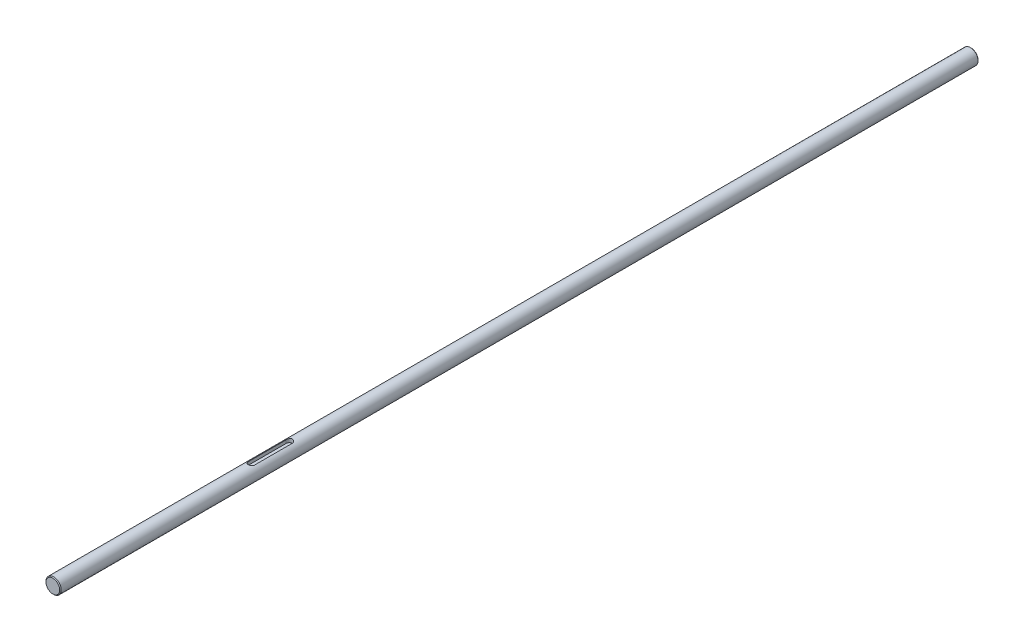
ISO-10303-21;
HEADER;
FILE_DESCRIPTION(('STEP AP214'),'2;1');
FILE_NAME('part.step','',(''),(''),'','','');
FILE_SCHEMA(('AUTOMOTIVE_DESIGN { 1 0 10303 214 1 1 1 1 }'));
ENDSEC;
DATA;
#1=APPLICATION_CONTEXT('core data for automotive mechanical design processes');
#2=APPLICATION_PROTOCOL_DEFINITION('international standard','automotive_design',2000,#1);
#3=PRODUCT_CONTEXT('',#1,'mechanical');
#4=PRODUCT('Part','Part','',(#3));
#5=PRODUCT_RELATED_PRODUCT_CATEGORY('part','',(#4));
#6=PRODUCT_DEFINITION_FORMATION('','',#4);
#7=PRODUCT_DEFINITION_CONTEXT('part definition',#1,'design');
#8=PRODUCT_DEFINITION('design','',#6,#7);
#9=PRODUCT_DEFINITION_SHAPE('','',#8);
#10=(LENGTH_UNIT() NAMED_UNIT(*) SI_UNIT(.MILLI.,.METRE.));
#11=(NAMED_UNIT(*) PLANE_ANGLE_UNIT() SI_UNIT($,.RADIAN.));
#12=(NAMED_UNIT(*) SI_UNIT($,.STERADIAN.) SOLID_ANGLE_UNIT());
#13=UNCERTAINTY_MEASURE_WITH_UNIT(LENGTH_MEASURE(1.E-05),#10,'distance_accuracy_value','');
#14=(GEOMETRIC_REPRESENTATION_CONTEXT(3) GLOBAL_UNCERTAINTY_ASSIGNED_CONTEXT((#13)) GLOBAL_UNIT_ASSIGNED_CONTEXT((#10,
#11,#12)) REPRESENTATION_CONTEXT('',''));
#15=CARTESIAN_POINT('',(0.,0.,0.));
#16=DIRECTION('',(0.,0.,1.));
#17=DIRECTION('',(1.,0.,0.));
#18=AXIS2_PLACEMENT_3D('',#15,#16,#17);
#19=CARTESIAN_POINT('',(0.,0.,602.));
#20=DIRECTION('',(0.,0.,-1.));
#21=DIRECTION('',(-1.,0.,0.));
#22=AXIS2_PLACEMENT_3D('',#19,#20,#21);
#23=CYLINDRICAL_SURFACE('',#22,5.);
#24=CARTESIAN_POINT('',(0.,0.,0.499999999999945));
#25=DIRECTION('',(0.,0.,1.));
#26=DIRECTION('',(1.,0.,0.));
#27=AXIS2_PLACEMENT_3D('',#24,#25,#26);
#28=CIRCLE('',#27,5.);
#29=CARTESIAN_POINT('',(5.,0.,0.499999999999945));
#30=VERTEX_POINT('',#29);
#31=EDGE_CURVE('E110',#30,#30,#28,.T.);
#32=ORIENTED_EDGE('',*,*,#31,.T.);
#33=EDGE_LOOP('',(#32));
#34=FACE_BOUND('',#33,.T.);
#35=CARTESIAN_POINT('',(0.,0.,601.5));
#36=DIRECTION('',(0.,0.,1.));
#37=DIRECTION('',(1.,0.,0.));
#38=AXIS2_PLACEMENT_3D('',#35,#36,#37);
#39=CIRCLE('',#38,5.);
#40=CARTESIAN_POINT('',(5.,0.,601.5));
#41=VERTEX_POINT('',#40);
#42=EDGE_CURVE('E113',#41,#41,#39,.F.);
#43=ORIENTED_EDGE('',*,*,#42,.T.);
#44=EDGE_LOOP('',(#43));
#45=FACE_BOUND('',#44,.T.);
#46=CARTESIAN_POINT('',(2.00000000000007,4.58257569495581,447.));
#47=CARTESIAN_POINT('',(2.00000798036355,4.58256464470378,446.946194147497));
#48=CARTESIAN_POINT('',(1.99782891366032,4.58352306077319,446.892394334442));
#49=CARTESIAN_POINT('',(1.98915905973454,4.5872962541754,446.785228701745));
#50=CARTESIAN_POINT('',(1.982669914688,4.59011032448542,446.731862724644));
#51=CARTESIAN_POINT('',(1.96547603676377,4.59749782920636,446.626153178441));
#52=CARTESIAN_POINT('',(1.95478796820441,4.6020643071753,446.573806415956));
#53=CARTESIAN_POINT('',(1.92931630190667,4.61280053296679,446.470299228285));
#54=CARTESIAN_POINT('',(1.91453245417097,4.61897037865395,446.419138875723));
#55=CARTESIAN_POINT('',(1.86426971793529,4.63959291248418,446.268064149418));
#56=CARTESIAN_POINT('',(1.82284489460014,4.65617449157428,446.17034576931));
#57=CARTESIAN_POINT('',(1.72548191592182,4.69312370765377,445.983204419917));
#58=CARTESIAN_POINT('',(1.66952996336932,4.71349493864005,445.893789447038));
#59=CARTESIAN_POINT('',(1.5413183573686,4.75700999402112,445.720737603326));
#60=CARTESIAN_POINT('',(1.46836913992735,4.78024245635514,445.63763278308));
#61=CARTESIAN_POINT('',(1.30969646176214,4.82612790548654,445.484459727789));
#62=CARTESIAN_POINT('',(1.22397038499688,4.84878077249719,445.414394169134));
#63=CARTESIAN_POINT('',(1.03800590808975,4.89203417106081,445.286593605804));
#64=CARTESIAN_POINT('',(0.937327933051017,4.91251824543529,445.229455190738));
#65=CARTESIAN_POINT('',(0.726824143246756,4.94803944125003,445.133155927311));
#66=CARTESIAN_POINT('',(0.61700216902629,4.96307883544184,445.093987575948));
#67=CARTESIAN_POINT('',(0.396967441295737,4.98538314653815,445.036658798689));
#68=CARTESIAN_POINT('',(0.287031054523107,4.99298922547927,445.017573049094));
#69=CARTESIAN_POINT('',(0.0652684304565662,5.00080310201085,444.997971520054));
#70=CARTESIAN_POINT('',(-0.0465571232841131,5.00101352053029,444.997449161976));
#71=CARTESIAN_POINT('',(-0.262233376226728,4.99421960045302,445.01448283916));
#72=CARTESIAN_POINT('',(-0.366179202506733,4.98761985585461,445.031025046674));
#73=CARTESIAN_POINT('',(-0.569674786500874,4.96849270441446,445.079993427054));
#74=CARTESIAN_POINT('',(-0.669224295072791,4.9559649620993,445.112420498869));
#75=CARTESIAN_POINT('',(-0.862897539070264,4.92596830598785,445.192636296424));
#76=CARTESIAN_POINT('',(-0.956916851366423,4.90842774755848,445.24064924081));
#77=CARTESIAN_POINT('',(-1.13580746919774,4.87014602008043,445.350464588595));
#78=CARTESIAN_POINT('',(-1.22067554984694,4.84940372896449,445.412271829691));
#79=CARTESIAN_POINT('',(-1.38476339273622,4.80521782746145,445.552644180259));
#80=CARTESIAN_POINT('',(-1.46324770308935,4.78168627172886,445.63204247467));
#81=CARTESIAN_POINT('',(-1.60609926099473,4.73561950584651,445.802980095148));
#82=CARTESIAN_POINT('',(-1.67046007709,4.71308475332784,445.894524922094));
#83=CARTESIAN_POINT('',(-1.784936579336,4.67095688856026,446.090470284021));
#84=CARTESIAN_POINT('',(-1.83458932217616,4.65146702150585,446.19516483666));
#85=CARTESIAN_POINT('',(-1.91521298357258,4.61886105059584,446.412361524429));
#86=CARTESIAN_POINT('',(-1.94621696002202,4.6057336762874,446.524849447338));
#87=CARTESIAN_POINT('',(-1.97810581825713,4.59208303529495,446.698743634158));
#88=CARTESIAN_POINT('',(-1.98630505165973,4.58853437680529,446.758657549301));
#89=CARTESIAN_POINT('',(-1.99725282103805,4.58377540314391,446.879035018996));
#90=CARTESIAN_POINT('',(-2.00000471568561,4.58256364711747,446.939498211758));
#91=CARTESIAN_POINT('',(-1.99999999999993,4.58257569495587,447.));
#92=B_SPLINE_CURVE_WITH_KNOTS('',3,(#46,#47,#48,#49,#50,#51,#52,#53,#54,#55,#56,#57,#58,#59,#60,
#61,#62,#63,#64,#65,#66,#67,#68,#69,#70,#71,#72,#73,#74,#75,#76,#77,#78,#79,#80,#81,#82,#83,#84,
#85,#86,#87,#88,#89,#90,#91),.UNSPECIFIED.,.F.,.F.,(4,2,2,2,2,2,2,2,2,2,2,2,2,2,2,2,2,2,2,2,2,2,
4),(0.,0.161354853098845,0.322648263883215,0.483307911251885,0.643977367092332,
0.964683001739125,1.28569434942628,1.62318047995504,1.96073580539195,2.31162858925766,
2.66237473197325,2.99613876504273,3.32978451514658,3.64468915259539,3.95961161305658,
4.27928176927554,4.59906421133024,4.93981874675159,5.28072813203936,5.63144241548469,
5.98153315592131,6.16300192557819,6.34435877193566),.UNSPECIFIED.);
#93=CARTESIAN_POINT('',(1.99999999999997,4.58257569495584,447.));
#94=VERTEX_POINT('',#93);
#95=CARTESIAN_POINT('',(-2.00000000000003,4.58257569495583,447.));
#96=VERTEX_POINT('',#95);
#97=EDGE_CURVE('E11',#94,#96,#92,.T.);
#98=ORIENTED_EDGE('',*,*,#97,.F.);
#99=DIRECTION('',(0.,0.,-1.));
#100=VECTOR('',#99,1.);
#101=CARTESIAN_POINT('',(1.99999999999999,4.58257569495584,602.));
#102=LINE('',#101,#100);
#103=CARTESIAN_POINT('',(1.99999999999999,4.58257569495584,472.));
#104=VERTEX_POINT('',#103);
#105=EDGE_CURVE('E119',#104,#94,#102,.T.);
#106=ORIENTED_EDGE('',*,*,#105,.F.);
#107=CARTESIAN_POINT('',(-1.99999999999993,4.58257569495587,472.));
#108=CARTESIAN_POINT('',(-2.0000079803634,4.58256464470384,472.053805852503));
#109=CARTESIAN_POINT('',(-1.99782891366018,4.58352306077326,472.107605665558));
#110=CARTESIAN_POINT('',(-1.9891590597344,4.58729625417546,472.214771298255));
#111=CARTESIAN_POINT('',(-1.98266991468786,4.59011032448548,472.268137275356));
#112=CARTESIAN_POINT('',(-1.96547603676363,4.59749782920642,472.373846821559));
#113=CARTESIAN_POINT('',(-1.95478796820427,4.60206430717535,472.426193584044));
#114=CARTESIAN_POINT('',(-1.92931630190652,4.61280053296685,472.529700771714));
#115=CARTESIAN_POINT('',(-1.91453245417082,4.61897037865401,472.580861124277));
#116=CARTESIAN_POINT('',(-1.86426971793515,4.63959291248424,472.731935850582));
#117=CARTESIAN_POINT('',(-1.8228448946,4.65617449157433,472.82965423069));
#118=CARTESIAN_POINT('',(-1.72548191592168,4.69312370765383,473.016795580083));
#119=CARTESIAN_POINT('',(-1.66952996336917,4.7134949386401,473.106210552962));
#120=CARTESIAN_POINT('',(-1.54131835736846,4.75700999402117,473.279262396674));
#121=CARTESIAN_POINT('',(-1.4683691399272,4.78024245635519,473.36236721692));
#122=CARTESIAN_POINT('',(-1.30969646176199,4.82612790548658,473.515540272211));
#123=CARTESIAN_POINT('',(-1.22397038499672,4.84878077249723,473.585605830866));
#124=CARTESIAN_POINT('',(-1.03800590808959,4.89203417106084,473.713406394196));
#125=CARTESIAN_POINT('',(-0.93732793305086,4.91251824543532,473.770544809262));
#126=CARTESIAN_POINT('',(-0.726824143246602,4.94803944125005,473.866844072689));
#127=CARTESIAN_POINT('',(-0.617002169026136,4.96307883544186,473.906012424052));
#128=CARTESIAN_POINT('',(-0.396967441295584,4.98538314653816,473.963341201311));
#129=CARTESIAN_POINT('',(-0.287031054522954,4.99298922547927,473.982426950906));
#130=CARTESIAN_POINT('',(-0.0652684304564169,5.00080310201085,474.002028479946));
#131=CARTESIAN_POINT('',(0.0465571232842593,5.00101352053029,474.002550838024));
#132=CARTESIAN_POINT('',(0.262233376226874,4.99421960045302,473.98551716084));
#133=CARTESIAN_POINT('',(0.366179202506883,4.9876198558546,473.968974953326));
#134=CARTESIAN_POINT('',(0.569674786501021,4.96849270441445,473.920006572946));
#135=CARTESIAN_POINT('',(0.669224295072932,4.95596496209928,473.887579501131));
#136=CARTESIAN_POINT('',(0.862897539070393,4.92596830598783,473.807363703575));
#137=CARTESIAN_POINT('',(0.956916851366546,4.90842774755845,473.759350759189));
#138=CARTESIAN_POINT('',(1.13580746919787,4.8701460200804,473.649535411405));
#139=CARTESIAN_POINT('',(1.22067554984708,4.84940372896446,473.587728170309));
#140=CARTESIAN_POINT('',(1.38476339273636,4.80521782746141,473.447355819741));
#141=CARTESIAN_POINT('',(1.4632477030895,4.78168627172881,473.36795752533));
#142=CARTESIAN_POINT('',(1.60609926099488,4.73561950584646,473.197019904852));
#143=CARTESIAN_POINT('',(1.67046007709015,4.71308475332779,473.105475077906));
#144=CARTESIAN_POINT('',(1.78493657933614,4.67095688856021,472.909529715979));
#145=CARTESIAN_POINT('',(1.83458932217631,4.65146702150579,472.80483516334));
#146=CARTESIAN_POINT('',(1.91521298357273,4.61886105059578,472.58763847557));
#147=CARTESIAN_POINT('',(1.94621696002216,4.60573367628734,472.475150552662));
#148=CARTESIAN_POINT('',(1.97810581825728,4.59208303529489,472.301256365842));
#149=CARTESIAN_POINT('',(1.98630505165987,4.58853437680523,472.241342450699));
#150=CARTESIAN_POINT('',(1.99725282103819,4.58377540314385,472.120964981004));
#151=CARTESIAN_POINT('',(2.00000471568576,4.58256364711741,472.060501788242));
#152=CARTESIAN_POINT('',(2.00000000000007,4.5825756949558,472.));
#153=B_SPLINE_CURVE_WITH_KNOTS('',3,(#107,#108,#109,#110,#111,#112,#113,#114,#115,#116,#117,
#118,#119,#120,#121,#122,#123,#124,#125,#126,#127,#128,#129,#130,#131,#132,#133,#134,#135,#136,
#137,#138,#139,#140,#141,#142,#143,#144,#145,#146,#147,#148,#149,#150,#151,#152),.UNSPECIFIED.,
.F.,.F.,(4,2,2,2,2,2,2,2,2,2,2,2,2,2,2,2,2,2,2,2,2,2,4),(0.,0.16135485309879,0.322648263883159,
0.483307911251884,0.643977367092332,0.964683001739124,1.28569434942628,1.62318047995504,
1.96073580539195,2.31162858925766,2.66237473197325,2.99613876504273,3.32978451514657,
3.64468915259536,3.95961161305657,4.27928176927552,4.59906421133024,4.93981874675159,
5.28072813203936,5.63144241548469,5.98153315592132,6.16300192557819,6.34435877193567),.UNSPECIFIED.);
#154=CARTESIAN_POINT('',(-1.99999999999993,4.58257569495587,472.));
#155=VERTEX_POINT('',#154);
#156=EDGE_CURVE('E121',#155,#104,#153,.T.);
#157=ORIENTED_EDGE('',*,*,#156,.F.);
#158=DIRECTION('',(0.,0.,-1.));
#159=VECTOR('',#158,1.);
#160=CARTESIAN_POINT('',(-2.00000000000001,4.58257569495583,602.));
#161=LINE('',#160,#159);
#162=EDGE_CURVE('E48',#96,#155,#161,.F.);
#163=ORIENTED_EDGE('',*,*,#162,.F.);
#164=EDGE_LOOP('',(#98,#106,#157,#163));
#165=FACE_BOUND('',#164,.T.);
#166=ADVANCED_FACE('F34',(#34,#45,#165),#23,.T.);
#167=CARTESIAN_POINT('',(0.,0.,602.));
#168=DIRECTION('',(0.,0.,1.));
#169=DIRECTION('',(1.,0.,0.));
#170=AXIS2_PLACEMENT_3D('',#167,#168,#169);
#171=PLANE('',#170);
#172=CARTESIAN_POINT('',(0.,0.,602.));
#173=DIRECTION('',(0.,0.,1.));
#174=DIRECTION('',(1.,0.,0.));
#175=AXIS2_PLACEMENT_3D('',#172,#173,#174);
#176=CIRCLE('',#175,4.5);
#177=CARTESIAN_POINT('',(4.5,0.,602.));
#178=VERTEX_POINT('',#177);
#179=EDGE_CURVE('E85',#178,#178,#176,.T.);
#180=ORIENTED_EDGE('',*,*,#179,.T.);
#181=EDGE_LOOP('',(#180));
#182=FACE_BOUND('',#181,.T.);
#183=ADVANCED_FACE('F141',(#182),#171,.T.);
#184=CARTESIAN_POINT('',(0.,0.,0.));
#185=DIRECTION('',(0.,0.,1.));
#186=DIRECTION('',(1.,0.,0.));
#187=AXIS2_PLACEMENT_3D('',#184,#185,#186);
#188=PLANE('',#187);
#189=CARTESIAN_POINT('',(0.,0.,0.));
#190=DIRECTION('',(0.,0.,1.));
#191=DIRECTION('',(1.,0.,0.));
#192=AXIS2_PLACEMENT_3D('',#189,#190,#191);
#193=CIRCLE('',#192,4.50000000000006);
#194=CARTESIAN_POINT('',(4.50000000000006,0.,0.));
#195=VERTEX_POINT('',#194);
#196=EDGE_CURVE('E116',#195,#195,#193,.F.);
#197=ORIENTED_EDGE('',*,*,#196,.T.);
#198=EDGE_LOOP('',(#197));
#199=FACE_BOUND('',#198,.T.);
#200=ADVANCED_FACE('F143',(#199),#188,.F.);
#201=CARTESIAN_POINT('',(0.,0.,602.));
#202=DIRECTION('',(0.,0.,-1.));
#203=DIRECTION('',(-1.,0.,0.));
#204=AXIS2_PLACEMENT_3D('',#201,#202,#203);
#205=CONICAL_SURFACE('',#204,4.5,0.785398163397497);
#206=ORIENTED_EDGE('',*,*,#42,.F.);
#207=EDGE_LOOP('',(#206));
#208=FACE_BOUND('',#207,.T.);
#209=ORIENTED_EDGE('',*,*,#179,.F.);
#210=EDGE_LOOP('',(#209));
#211=FACE_BOUND('',#210,.T.);
#212=ADVANCED_FACE('F146',(#208,#211),#205,.T.);
#213=CARTESIAN_POINT('',(0.,0.,0.499999999999945));
#214=DIRECTION('',(0.,0.,1.));
#215=DIRECTION('',(1.,0.,0.));
#216=AXIS2_PLACEMENT_3D('',#213,#214,#215);
#217=CONICAL_SURFACE('',#216,5.,0.785398163397441);
#218=ORIENTED_EDGE('',*,*,#196,.F.);
#219=EDGE_LOOP('',(#218));
#220=FACE_BOUND('',#219,.T.);
#221=ORIENTED_EDGE('',*,*,#31,.F.);
#222=EDGE_LOOP('',(#221));
#223=FACE_BOUND('',#222,.T.);
#224=ADVANCED_FACE('F36',(#220,#223),#217,.T.);
#225=CARTESIAN_POINT('',(0.,12.5,447.));
#226=DIRECTION('',(0.,-1.,0.));
#227=DIRECTION('',(0.,0.,-1.));
#228=AXIS2_PLACEMENT_3D('',#225,#226,#227);
#229=CYLINDRICAL_SURFACE('',#228,2.);
#230=ORIENTED_EDGE('',*,*,#97,.T.);
#231=DIRECTION('',(0.,-1.,0.));
#232=VECTOR('',#231,1.);
#233=CARTESIAN_POINT('',(-2.00000000000003,12.5,447.));
#234=LINE('',#233,#232);
#235=CARTESIAN_POINT('',(-2.00000000000003,2.5,447.));
#236=VERTEX_POINT('',#235);
#237=EDGE_CURVE('E78',#96,#236,#234,.T.);
#238=ORIENTED_EDGE('',*,*,#237,.T.);
#239=CARTESIAN_POINT('',(0.,2.5,447.));
#240=DIRECTION('',(0.,1.,0.));
#241=DIRECTION('',(0.,0.,1.));
#242=AXIS2_PLACEMENT_3D('',#239,#240,#241);
#243=CIRCLE('',#242,2.);
#244=CARTESIAN_POINT('',(1.99999999999997,2.5,447.));
#245=VERTEX_POINT('',#244);
#246=EDGE_CURVE('E82',#245,#236,#243,.T.);
#247=ORIENTED_EDGE('',*,*,#246,.F.);
#248=DIRECTION('',(0.,-1.,0.));
#249=VECTOR('',#248,1.);
#250=CARTESIAN_POINT('',(1.99999999999997,12.5,447.));
#251=LINE('',#250,#249);
#252=EDGE_CURVE('E104',#94,#245,#251,.T.);
#253=ORIENTED_EDGE('',*,*,#252,.F.);
#254=EDGE_LOOP('',(#230,#238,#247,#253));
#255=FACE_BOUND('',#254,.T.);
#256=ADVANCED_FACE('F80',(#255),#229,.F.);
#257=CARTESIAN_POINT('',(-2.00000000000003,12.5,472.));
#258=DIRECTION('',(1.,0.,0.));
#259=DIRECTION('',(0.,0.,-1.));
#260=AXIS2_PLACEMENT_3D('',#257,#258,#259);
#261=PLANE('',#260);
#262=ORIENTED_EDGE('',*,*,#162,.T.);
#263=DIRECTION('',(0.,-1.,0.));
#264=VECTOR('',#263,1.);
#265=CARTESIAN_POINT('',(-1.99999999999993,12.5,472.));
#266=LINE('',#265,#264);
#267=CARTESIAN_POINT('',(-1.99999999999993,2.5,472.));
#268=VERTEX_POINT('',#267);
#269=EDGE_CURVE('E86',#155,#268,#266,.T.);
#270=ORIENTED_EDGE('',*,*,#269,.T.);
#271=DIRECTION('',(0.,0.,1.));
#272=VECTOR('',#271,1.);
#273=CARTESIAN_POINT('',(-2.00000000000003,2.5,472.));
#274=LINE('',#273,#272);
#275=EDGE_CURVE('E89',#236,#268,#274,.T.);
#276=ORIENTED_EDGE('',*,*,#275,.F.);
#277=ORIENTED_EDGE('',*,*,#237,.F.);
#278=EDGE_LOOP('',(#262,#270,#276,#277));
#279=FACE_BOUND('',#278,.T.);
#280=ADVANCED_FACE('F90',(#279),#261,.T.);
#281=CARTESIAN_POINT('',(0.,12.5,472.));
#282=DIRECTION('',(0.,-1.,0.));
#283=DIRECTION('',(0.,0.,-1.));
#284=AXIS2_PLACEMENT_3D('',#281,#282,#283);
#285=CYLINDRICAL_SURFACE('',#284,2.);
#286=ORIENTED_EDGE('',*,*,#156,.T.);
#287=DIRECTION('',(0.,-1.,0.));
#288=VECTOR('',#287,1.);
#289=CARTESIAN_POINT('',(1.99999999999997,12.5,472.));
#290=LINE('',#289,#288);
#291=CARTESIAN_POINT('',(1.99999999999997,2.5,472.));
#292=VERTEX_POINT('',#291);
#293=EDGE_CURVE('E55',#104,#292,#290,.T.);
#294=ORIENTED_EDGE('',*,*,#293,.T.);
#295=CARTESIAN_POINT('',(0.,2.5,472.));
#296=DIRECTION('',(0.,1.,0.));
#297=DIRECTION('',(0.,0.,-1.));
#298=AXIS2_PLACEMENT_3D('',#295,#296,#297);
#299=CIRCLE('',#298,2.);
#300=EDGE_CURVE('E95',#268,#292,#299,.T.);
#301=ORIENTED_EDGE('',*,*,#300,.F.);
#302=ORIENTED_EDGE('',*,*,#269,.F.);
#303=EDGE_LOOP('',(#286,#294,#301,#302));
#304=FACE_BOUND('',#303,.T.);
#305=ADVANCED_FACE('F129',(#304),#285,.F.);
#306=CARTESIAN_POINT('',(1.99999999999997,12.5,472.));
#307=DIRECTION('',(-1.,0.,0.));
#308=DIRECTION('',(0.,0.,1.));
#309=AXIS2_PLACEMENT_3D('',#306,#307,#308);
#310=PLANE('',#309);
#311=ORIENTED_EDGE('',*,*,#105,.T.);
#312=ORIENTED_EDGE('',*,*,#252,.T.);
#313=DIRECTION('',(0.,0.,-1.));
#314=VECTOR('',#313,1.);
#315=CARTESIAN_POINT('',(1.99999999999997,2.5,472.));
#316=LINE('',#315,#314);
#317=EDGE_CURVE('E99',#292,#245,#316,.T.);
#318=ORIENTED_EDGE('',*,*,#317,.F.);
#319=ORIENTED_EDGE('',*,*,#293,.F.);
#320=EDGE_LOOP('',(#311,#312,#318,#319));
#321=FACE_BOUND('',#320,.T.);
#322=ADVANCED_FACE('F134',(#321),#310,.T.);
#323=CARTESIAN_POINT('',(0.,2.5,447.));
#324=DIRECTION('',(0.,1.,0.));
#325=DIRECTION('',(0.,0.,1.));
#326=AXIS2_PLACEMENT_3D('',#323,#324,#325);
#327=PLANE('',#326);
#328=ORIENTED_EDGE('',*,*,#246,.T.);
#329=ORIENTED_EDGE('',*,*,#275,.T.);
#330=ORIENTED_EDGE('',*,*,#300,.T.);
#331=ORIENTED_EDGE('',*,*,#317,.T.);
#332=EDGE_LOOP('',(#328,#329,#330,#331));
#333=FACE_BOUND('',#332,.T.);
#334=ADVANCED_FACE('F98',(#333),#327,.T.);
#335=CLOSED_SHELL('',(#166,#183,#200,#212,#224,#256,#280,#305,#322,#334));
#336=MANIFOLD_SOLID_BREP('B2',#335);
#337=ADVANCED_BREP_SHAPE_REPRESENTATION('',(#18,#336),#14);
#338=SHAPE_DEFINITION_REPRESENTATION(#9,#337);
ENDSEC;
END-ISO-10303-21;
